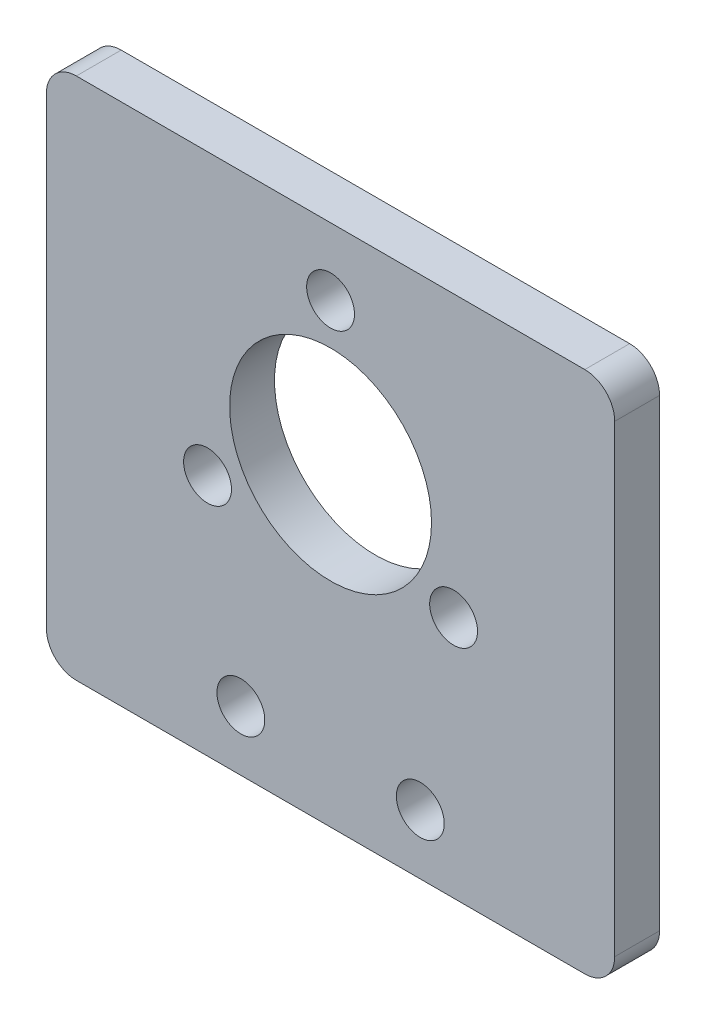
ISO-10303-21;
HEADER;
FILE_DESCRIPTION(('STEP AP214'),'2;1');
FILE_NAME('part.step','',(''),(''),'','','');
FILE_SCHEMA(('AUTOMOTIVE_DESIGN { 1 0 10303 214 1 1 1 1 }'));
ENDSEC;
DATA;
#1=APPLICATION_CONTEXT('core data for automotive mechanical design processes');
#2=APPLICATION_PROTOCOL_DEFINITION('international standard','automotive_design',2000,#1);
#3=PRODUCT_CONTEXT('',#1,'mechanical');
#4=PRODUCT('Part','Part','',(#3));
#5=PRODUCT_RELATED_PRODUCT_CATEGORY('part','',(#4));
#6=PRODUCT_DEFINITION_FORMATION('','',#4);
#7=PRODUCT_DEFINITION_CONTEXT('part definition',#1,'design');
#8=PRODUCT_DEFINITION('design','',#6,#7);
#9=PRODUCT_DEFINITION_SHAPE('','',#8);
#10=(LENGTH_UNIT() NAMED_UNIT(*) SI_UNIT(.MILLI.,.METRE.));
#11=(NAMED_UNIT(*) PLANE_ANGLE_UNIT() SI_UNIT($,.RADIAN.));
#12=(NAMED_UNIT(*) SI_UNIT($,.STERADIAN.) SOLID_ANGLE_UNIT());
#13=UNCERTAINTY_MEASURE_WITH_UNIT(LENGTH_MEASURE(1.E-05),#10,'distance_accuracy_value','');
#14=(GEOMETRIC_REPRESENTATION_CONTEXT(3) GLOBAL_UNCERTAINTY_ASSIGNED_CONTEXT((#13)) GLOBAL_UNIT_ASSIGNED_CONTEXT((#10,
#11,#12)) REPRESENTATION_CONTEXT('',''));
#15=CARTESIAN_POINT('',(0.,0.,0.));
#16=DIRECTION('',(0.,0.,1.));
#17=DIRECTION('',(1.,0.,0.));
#18=AXIS2_PLACEMENT_3D('',#15,#16,#17);
#19=CARTESIAN_POINT('',(36.,-2.,3.));
#20=DIRECTION('',(0.,0.,-1.));
#21=DIRECTION('',(-1.,0.,0.));
#22=AXIS2_PLACEMENT_3D('',#19,#20,#21);
#23=PLANE('',#22);
#24=CARTESIAN_POINT('',(25.,-38.,3.));
#25=DIRECTION('',(0.,0.,-1.));
#26=DIRECTION('',(-1.,0.,0.));
#27=AXIS2_PLACEMENT_3D('',#24,#25,#26);
#28=CIRCLE('',#27,1.6);
#29=CARTESIAN_POINT('',(23.4,-38.,3.));
#30=VERTEX_POINT('',#29);
#31=EDGE_CURVE('E177',#30,#30,#28,.T.);
#32=ORIENTED_EDGE('',*,*,#31,.T.);
#33=EDGE_LOOP('',(#32));
#34=FACE_BOUND('',#33,.T.);
#35=CARTESIAN_POINT('',(13.,-38.,3.));
#36=DIRECTION('',(0.,0.,-1.));
#37=DIRECTION('',(-1.,0.,0.));
#38=AXIS2_PLACEMENT_3D('',#35,#36,#37);
#39=CIRCLE('',#38,1.6);
#40=CARTESIAN_POINT('',(11.4,-38.,3.));
#41=VERTEX_POINT('',#40);
#42=EDGE_CURVE('E171',#41,#41,#39,.T.);
#43=ORIENTED_EDGE('',*,*,#42,.T.);
#44=EDGE_LOOP('',(#43));
#45=FACE_BOUND('',#44,.T.);
#46=DIRECTION('',(0.,1.,0.));
#47=VECTOR('',#46,1.);
#48=CARTESIAN_POINT('',(38.,-2.,3.));
#49=LINE('',#48,#47);
#50=CARTESIAN_POINT('',(38.,-40.,3.));
#51=VERTEX_POINT('',#50);
#52=CARTESIAN_POINT('',(38.,-9.00000000000001,3.));
#53=VERTEX_POINT('',#52);
#54=EDGE_CURVE('E153',#51,#53,#49,.T.);
#55=ORIENTED_EDGE('',*,*,#54,.T.);
#56=CARTESIAN_POINT('',(36.,-9.00000000000001,3.));
#57=DIRECTION('',(0.,0.,-1.));
#58=DIRECTION('',(-1.,0.,0.));
#59=AXIS2_PLACEMENT_3D('',#56,#57,#58);
#60=CIRCLE('',#59,2.);
#61=CARTESIAN_POINT('',(36.,-7.00000000000001,3.));
#62=VERTEX_POINT('',#61);
#63=EDGE_CURVE('E265',#53,#62,#60,.F.);
#64=ORIENTED_EDGE('',*,*,#63,.T.);
#65=DIRECTION('',(1.,0.,0.));
#66=VECTOR('',#65,1.);
#67=CARTESIAN_POINT('',(-8.75050010966886,-7.00000000000001,3.));
#68=LINE('',#67,#66);
#69=CARTESIAN_POINT('',(2.,-7.00000000000001,3.));
#70=VERTEX_POINT('',#69);
#71=EDGE_CURVE('E163',#70,#62,#68,.T.);
#72=ORIENTED_EDGE('',*,*,#71,.F.);
#73=CARTESIAN_POINT('',(2.,-9.00000000000001,3.));
#74=DIRECTION('',(0.,0.,-1.));
#75=DIRECTION('',(-1.,0.,0.));
#76=AXIS2_PLACEMENT_3D('',#73,#74,#75);
#77=CIRCLE('',#76,2.);
#78=CARTESIAN_POINT('',(0.,-9.00000000000001,3.));
#79=VERTEX_POINT('',#78);
#80=EDGE_CURVE('E117',#70,#79,#77,.F.);
#81=ORIENTED_EDGE('',*,*,#80,.T.);
#82=DIRECTION('',(0.,-1.,0.));
#83=VECTOR('',#82,1.);
#84=CARTESIAN_POINT('',(0.,-2.00000000000001,3.));
#85=LINE('',#84,#83);
#86=CARTESIAN_POINT('',(0.,-40.,3.));
#87=VERTEX_POINT('',#86);
#88=EDGE_CURVE('E108',#79,#87,#85,.T.);
#89=ORIENTED_EDGE('',*,*,#88,.T.);
#90=CARTESIAN_POINT('',(2.00000000000001,-40.,3.));
#91=DIRECTION('',(0.,0.,1.));
#92=DIRECTION('',(1.,0.,0.));
#93=AXIS2_PLACEMENT_3D('',#90,#91,#92);
#94=CIRCLE('',#93,2.);
#95=CARTESIAN_POINT('',(2.,-42.,3.));
#96=VERTEX_POINT('',#95);
#97=EDGE_CURVE('E113',#87,#96,#94,.T.);
#98=ORIENTED_EDGE('',*,*,#97,.T.);
#99=DIRECTION('',(1.,0.,0.));
#100=VECTOR('',#99,1.);
#101=CARTESIAN_POINT('',(2.,-42.,3.));
#102=LINE('',#101,#100);
#103=CARTESIAN_POINT('',(36.,-42.,3.));
#104=VERTEX_POINT('',#103);
#105=EDGE_CURVE('E134',#96,#104,#102,.T.);
#106=ORIENTED_EDGE('',*,*,#105,.T.);
#107=CARTESIAN_POINT('',(36.,-40.,3.));
#108=DIRECTION('',(0.,0.,1.));
#109=DIRECTION('',(1.,0.,0.));
#110=AXIS2_PLACEMENT_3D('',#107,#108,#109);
#111=CIRCLE('',#110,2.);
#112=EDGE_CURVE('E136',#104,#51,#111,.T.);
#113=ORIENTED_EDGE('',*,*,#112,.T.);
#114=EDGE_LOOP('',(#55,#64,#72,#81,#89,#98,#106,#113));
#115=FACE_BOUND('',#114,.T.);
#116=CARTESIAN_POINT('',(19.,-21.,3.));
#117=DIRECTION('',(0.,0.,1.));
#118=DIRECTION('',(1.,0.,0.));
#119=AXIS2_PLACEMENT_3D('',#116,#117,#118);
#120=CIRCLE('',#119,6.75);
#121=CARTESIAN_POINT('',(25.75,-21.,3.));
#122=VERTEX_POINT('',#121);
#123=EDGE_CURVE('E200',#122,#122,#120,.T.);
#124=ORIENTED_EDGE('',*,*,#123,.F.);
#125=EDGE_LOOP('',(#124));
#126=FACE_BOUND('',#125,.T.);
#127=CARTESIAN_POINT('',(19.,-11.5,3.));
#128=DIRECTION('',(0.,0.,1.));
#129=DIRECTION('',(1.,0.,0.));
#130=AXIS2_PLACEMENT_3D('',#127,#128,#129);
#131=CIRCLE('',#130,1.6);
#132=CARTESIAN_POINT('',(20.6,-11.5,3.));
#133=VERTEX_POINT('',#132);
#134=EDGE_CURVE('E194',#133,#133,#131,.T.);
#135=ORIENTED_EDGE('',*,*,#134,.F.);
#136=EDGE_LOOP('',(#135));
#137=FACE_BOUND('',#136,.T.);
#138=CARTESIAN_POINT('',(27.2272413359522,-25.75,3.));
#139=DIRECTION('',(0.,0.,1.));
#140=DIRECTION('',(1.,0.,0.));
#141=AXIS2_PLACEMENT_3D('',#138,#139,#140);
#142=CIRCLE('',#141,1.6);
#143=CARTESIAN_POINT('',(28.8272413359522,-25.75,3.));
#144=VERTEX_POINT('',#143);
#145=EDGE_CURVE('E188',#144,#144,#142,.T.);
#146=ORIENTED_EDGE('',*,*,#145,.F.);
#147=EDGE_LOOP('',(#146));
#148=FACE_BOUND('',#147,.T.);
#149=CARTESIAN_POINT('',(10.7727586640478,-25.75,3.));
#150=DIRECTION('',(0.,0.,1.));
#151=DIRECTION('',(1.,0.,0.));
#152=AXIS2_PLACEMENT_3D('',#149,#150,#151);
#153=CIRCLE('',#152,1.6);
#154=CARTESIAN_POINT('',(12.3727586640478,-25.75,3.));
#155=VERTEX_POINT('',#154);
#156=EDGE_CURVE('E181',#155,#155,#153,.T.);
#157=ORIENTED_EDGE('',*,*,#156,.F.);
#158=EDGE_LOOP('',(#157));
#159=FACE_BOUND('',#158,.T.);
#160=ADVANCED_FACE('F42',(#34,#45,#115,#126,#137,#148,#159),#23,.F.);
#161=CARTESIAN_POINT('',(36.,-2.,0.));
#162=DIRECTION('',(0.,0.,-1.));
#163=DIRECTION('',(-1.,0.,0.));
#164=AXIS2_PLACEMENT_3D('',#161,#162,#163);
#165=PLANE('',#164);
#166=DIRECTION('',(1.,0.,0.));
#167=VECTOR('',#166,1.);
#168=CARTESIAN_POINT('',(-8.75050010966886,-7.00000000000001,0.));
#169=LINE('',#168,#167);
#170=CARTESIAN_POINT('',(2.,-7.00000000000001,0.));
#171=VERTEX_POINT('',#170);
#172=CARTESIAN_POINT('',(36.,-7.00000000000001,0.));
#173=VERTEX_POINT('',#172);
#174=EDGE_CURVE('E167',#171,#173,#169,.T.);
#175=ORIENTED_EDGE('',*,*,#174,.T.);
#176=CARTESIAN_POINT('',(36.,-9.00000000000001,0.));
#177=DIRECTION('',(0.,0.,-1.));
#178=DIRECTION('',(-1.,0.,0.));
#179=AXIS2_PLACEMENT_3D('',#176,#177,#178);
#180=CIRCLE('',#179,2.);
#181=CARTESIAN_POINT('',(38.,-9.00000000000001,0.));
#182=VERTEX_POINT('',#181);
#183=EDGE_CURVE('E50',#173,#182,#180,.T.);
#184=ORIENTED_EDGE('',*,*,#183,.T.);
#185=DIRECTION('',(0.,1.,0.));
#186=VECTOR('',#185,1.);
#187=CARTESIAN_POINT('',(38.,-2.,0.));
#188=LINE('',#187,#186);
#189=CARTESIAN_POINT('',(38.,-40.,0.));
#190=VERTEX_POINT('',#189);
#191=EDGE_CURVE('E119',#190,#182,#188,.T.);
#192=ORIENTED_EDGE('',*,*,#191,.F.);
#193=CARTESIAN_POINT('',(36.,-40.,0.));
#194=DIRECTION('',(0.,0.,1.));
#195=DIRECTION('',(1.,0.,0.));
#196=AXIS2_PLACEMENT_3D('',#193,#194,#195);
#197=CIRCLE('',#196,2.);
#198=CARTESIAN_POINT('',(36.,-42.,0.));
#199=VERTEX_POINT('',#198);
#200=EDGE_CURVE('E276',#199,#190,#197,.T.);
#201=ORIENTED_EDGE('',*,*,#200,.F.);
#202=DIRECTION('',(1.,0.,0.));
#203=VECTOR('',#202,1.);
#204=CARTESIAN_POINT('',(2.,-42.,0.));
#205=LINE('',#204,#203);
#206=CARTESIAN_POINT('',(2.,-42.,0.));
#207=VERTEX_POINT('',#206);
#208=EDGE_CURVE('E278',#207,#199,#205,.T.);
#209=ORIENTED_EDGE('',*,*,#208,.F.);
#210=CARTESIAN_POINT('',(2.00000000000001,-40.,0.));
#211=DIRECTION('',(0.,0.,1.));
#212=DIRECTION('',(1.,0.,0.));
#213=AXIS2_PLACEMENT_3D('',#210,#211,#212);
#214=CIRCLE('',#213,2.);
#215=CARTESIAN_POINT('',(0.,-40.,0.));
#216=VERTEX_POINT('',#215);
#217=EDGE_CURVE('E279',#216,#207,#214,.T.);
#218=ORIENTED_EDGE('',*,*,#217,.F.);
#219=DIRECTION('',(0.,-1.,0.));
#220=VECTOR('',#219,1.);
#221=CARTESIAN_POINT('',(0.,-2.00000000000001,0.));
#222=LINE('',#221,#220);
#223=CARTESIAN_POINT('',(0.,-9.00000000000001,0.));
#224=VERTEX_POINT('',#223);
#225=EDGE_CURVE('E125',#224,#216,#222,.T.);
#226=ORIENTED_EDGE('',*,*,#225,.F.);
#227=CARTESIAN_POINT('',(2.,-9.00000000000001,0.));
#228=DIRECTION('',(0.,0.,-1.));
#229=DIRECTION('',(-1.,0.,0.));
#230=AXIS2_PLACEMENT_3D('',#227,#228,#229);
#231=CIRCLE('',#230,2.);
#232=EDGE_CURVE('E57',#224,#171,#231,.T.);
#233=ORIENTED_EDGE('',*,*,#232,.T.);
#234=EDGE_LOOP('',(#175,#184,#192,#201,#209,#218,#226,#233));
#235=FACE_BOUND('',#234,.T.);
#236=CARTESIAN_POINT('',(25.,-38.,0.));
#237=DIRECTION('',(0.,0.,-1.));
#238=DIRECTION('',(-1.,0.,0.));
#239=AXIS2_PLACEMENT_3D('',#236,#237,#238);
#240=CIRCLE('',#239,1.6);
#241=CARTESIAN_POINT('',(23.4,-38.,0.));
#242=VERTEX_POINT('',#241);
#243=EDGE_CURVE('E168',#242,#242,#240,.T.);
#244=ORIENTED_EDGE('',*,*,#243,.F.);
#245=EDGE_LOOP('',(#244));
#246=FACE_BOUND('',#245,.T.);
#247=CARTESIAN_POINT('',(13.,-38.,0.));
#248=DIRECTION('',(0.,0.,-1.));
#249=DIRECTION('',(1.,0.,0.));
#250=AXIS2_PLACEMENT_3D('',#247,#248,#249);
#251=CIRCLE('',#250,1.6);
#252=CARTESIAN_POINT('',(14.6,-38.,0.));
#253=VERTEX_POINT('',#252);
#254=EDGE_CURVE('E172',#253,#253,#251,.T.);
#255=ORIENTED_EDGE('',*,*,#254,.F.);
#256=EDGE_LOOP('',(#255));
#257=FACE_BOUND('',#256,.T.);
#258=CARTESIAN_POINT('',(27.2272413359522,-25.75,0.));
#259=DIRECTION('',(0.,0.,1.));
#260=DIRECTION('',(1.,0.,0.));
#261=AXIS2_PLACEMENT_3D('',#258,#259,#260);
#262=CIRCLE('',#261,1.6);
#263=CARTESIAN_POINT('',(28.8272413359522,-25.75,0.));
#264=VERTEX_POINT('',#263);
#265=EDGE_CURVE('E185',#264,#264,#262,.T.);
#266=ORIENTED_EDGE('',*,*,#265,.T.);
#267=EDGE_LOOP('',(#266));
#268=FACE_BOUND('',#267,.T.);
#269=CARTESIAN_POINT('',(19.,-21.,0.));
#270=DIRECTION('',(0.,0.,1.));
#271=DIRECTION('',(1.,0.,0.));
#272=AXIS2_PLACEMENT_3D('',#269,#270,#271);
#273=CIRCLE('',#272,6.75);
#274=CARTESIAN_POINT('',(25.75,-21.,0.));
#275=VERTEX_POINT('',#274);
#276=EDGE_CURVE('E198',#275,#275,#273,.T.);
#277=ORIENTED_EDGE('',*,*,#276,.T.);
#278=EDGE_LOOP('',(#277));
#279=FACE_BOUND('',#278,.T.);
#280=CARTESIAN_POINT('',(19.,-11.5,0.));
#281=DIRECTION('',(0.,0.,1.));
#282=DIRECTION('',(1.,0.,0.));
#283=AXIS2_PLACEMENT_3D('',#280,#281,#282);
#284=CIRCLE('',#283,1.6);
#285=CARTESIAN_POINT('',(20.6,-11.5,0.));
#286=VERTEX_POINT('',#285);
#287=EDGE_CURVE('E192',#286,#286,#284,.T.);
#288=ORIENTED_EDGE('',*,*,#287,.T.);
#289=EDGE_LOOP('',(#288));
#290=FACE_BOUND('',#289,.T.);
#291=CARTESIAN_POINT('',(10.7727586640478,-25.75,0.));
#292=DIRECTION('',(0.,0.,1.));
#293=DIRECTION('',(1.,0.,0.));
#294=AXIS2_PLACEMENT_3D('',#291,#292,#293);
#295=CIRCLE('',#294,1.6);
#296=CARTESIAN_POINT('',(12.3727586640478,-25.75,0.));
#297=VERTEX_POINT('',#296);
#298=EDGE_CURVE('E180',#297,#297,#295,.T.);
#299=ORIENTED_EDGE('',*,*,#298,.T.);
#300=EDGE_LOOP('',(#299));
#301=FACE_BOUND('',#300,.T.);
#302=ADVANCED_FACE('F206',(#235,#246,#257,#268,#279,#290,#301),#165,.T.);
#303=CARTESIAN_POINT('',(0.,-2.00000000000001,3.));
#304=DIRECTION('',(1.,0.,0.));
#305=DIRECTION('',(0.,1.,0.));
#306=AXIS2_PLACEMENT_3D('',#303,#304,#305);
#307=PLANE('',#306);
#308=ORIENTED_EDGE('',*,*,#88,.F.);
#309=DIRECTION('',(0.,0.,-1.));
#310=VECTOR('',#309,1.);
#311=CARTESIAN_POINT('',(0.,-9.00000000000001,3.));
#312=LINE('',#311,#310);
#313=EDGE_CURVE('E12',#79,#224,#312,.T.);
#314=ORIENTED_EDGE('',*,*,#313,.T.);
#315=ORIENTED_EDGE('',*,*,#225,.T.);
#316=DIRECTION('',(0.,0.,-1.));
#317=VECTOR('',#316,1.);
#318=CARTESIAN_POINT('',(0.,-40.,3.));
#319=LINE('',#318,#317);
#320=EDGE_CURVE('E122',#87,#216,#319,.T.);
#321=ORIENTED_EDGE('',*,*,#320,.F.);
#322=EDGE_LOOP('',(#308,#314,#315,#321));
#323=FACE_BOUND('',#322,.T.);
#324=ADVANCED_FACE('F123',(#323),#307,.F.);
#325=CARTESIAN_POINT('',(2.00000000000001,-40.,3.));
#326=DIRECTION('',(0.,0.,-1.));
#327=DIRECTION('',(-1.,0.,0.));
#328=AXIS2_PLACEMENT_3D('',#325,#326,#327);
#329=CYLINDRICAL_SURFACE('',#328,2.);
#330=ORIENTED_EDGE('',*,*,#217,.T.);
#331=DIRECTION('',(0.,0.,-1.));
#332=VECTOR('',#331,1.);
#333=CARTESIAN_POINT('',(2.,-42.,3.));
#334=LINE('',#333,#332);
#335=EDGE_CURVE('E129',#96,#207,#334,.T.);
#336=ORIENTED_EDGE('',*,*,#335,.F.);
#337=ORIENTED_EDGE('',*,*,#97,.F.);
#338=ORIENTED_EDGE('',*,*,#320,.T.);
#339=EDGE_LOOP('',(#330,#336,#337,#338));
#340=FACE_BOUND('',#339,.T.);
#341=ADVANCED_FACE('F131',(#340),#329,.T.);
#342=CARTESIAN_POINT('',(2.,-42.,3.));
#343=DIRECTION('',(0.,1.,0.));
#344=DIRECTION('',(0.,0.,1.));
#345=AXIS2_PLACEMENT_3D('',#342,#343,#344);
#346=PLANE('',#345);
#347=ORIENTED_EDGE('',*,*,#208,.T.);
#348=DIRECTION('',(0.,0.,-1.));
#349=VECTOR('',#348,1.);
#350=CARTESIAN_POINT('',(36.,-42.,3.));
#351=LINE('',#350,#349);
#352=EDGE_CURVE('E270',#104,#199,#351,.T.);
#353=ORIENTED_EDGE('',*,*,#352,.F.);
#354=ORIENTED_EDGE('',*,*,#105,.F.);
#355=ORIENTED_EDGE('',*,*,#335,.T.);
#356=EDGE_LOOP('',(#347,#353,#354,#355));
#357=FACE_BOUND('',#356,.T.);
#358=ADVANCED_FACE('F237',(#357),#346,.F.);
#359=CARTESIAN_POINT('',(36.,-40.,3.));
#360=DIRECTION('',(0.,0.,-1.));
#361=DIRECTION('',(-1.,0.,0.));
#362=AXIS2_PLACEMENT_3D('',#359,#360,#361);
#363=CYLINDRICAL_SURFACE('',#362,2.);
#364=ORIENTED_EDGE('',*,*,#200,.T.);
#365=DIRECTION('',(0.,0.,-1.));
#366=VECTOR('',#365,1.);
#367=CARTESIAN_POINT('',(38.,-40.,3.));
#368=LINE('',#367,#366);
#369=EDGE_CURVE('E156',#51,#190,#368,.T.);
#370=ORIENTED_EDGE('',*,*,#369,.F.);
#371=ORIENTED_EDGE('',*,*,#112,.F.);
#372=ORIENTED_EDGE('',*,*,#352,.T.);
#373=EDGE_LOOP('',(#364,#370,#371,#372));
#374=FACE_BOUND('',#373,.T.);
#375=ADVANCED_FACE('F222',(#374),#363,.T.);
#376=CARTESIAN_POINT('',(38.,-2.,3.));
#377=DIRECTION('',(-1.,0.,0.));
#378=DIRECTION('',(0.,-1.,0.));
#379=AXIS2_PLACEMENT_3D('',#376,#377,#378);
#380=PLANE('',#379);
#381=ORIENTED_EDGE('',*,*,#191,.T.);
#382=DIRECTION('',(0.,0.,1.));
#383=VECTOR('',#382,1.);
#384=CARTESIAN_POINT('',(38.,-9.00000000000001,3.));
#385=LINE('',#384,#383);
#386=EDGE_CURVE('E128',#182,#53,#385,.T.);
#387=ORIENTED_EDGE('',*,*,#386,.T.);
#388=ORIENTED_EDGE('',*,*,#54,.F.);
#389=ORIENTED_EDGE('',*,*,#369,.T.);
#390=EDGE_LOOP('',(#381,#387,#388,#389));
#391=FACE_BOUND('',#390,.T.);
#392=ADVANCED_FACE('F212',(#391),#380,.F.);
#393=CARTESIAN_POINT('',(19.,-21.,3.));
#394=DIRECTION('',(0.,0.,-1.));
#395=DIRECTION('',(-1.,0.,0.));
#396=AXIS2_PLACEMENT_3D('',#393,#394,#395);
#397=CYLINDRICAL_SURFACE('',#396,6.75);
#398=ORIENTED_EDGE('',*,*,#123,.T.);
#399=EDGE_LOOP('',(#398));
#400=FACE_BOUND('',#399,.T.);
#401=ORIENTED_EDGE('',*,*,#276,.F.);
#402=EDGE_LOOP('',(#401));
#403=FACE_BOUND('',#402,.T.);
#404=ADVANCED_FACE('F209',(#400,#403),#397,.F.);
#405=CARTESIAN_POINT('',(19.,-11.5,3.));
#406=DIRECTION('',(0.,0.,-1.));
#407=DIRECTION('',(-1.,0.,0.));
#408=AXIS2_PLACEMENT_3D('',#405,#406,#407);
#409=CYLINDRICAL_SURFACE('',#408,1.6);
#410=ORIENTED_EDGE('',*,*,#134,.T.);
#411=EDGE_LOOP('',(#410));
#412=FACE_BOUND('',#411,.T.);
#413=ORIENTED_EDGE('',*,*,#287,.F.);
#414=EDGE_LOOP('',(#413));
#415=FACE_BOUND('',#414,.T.);
#416=ADVANCED_FACE('F211',(#412,#415),#409,.F.);
#417=CARTESIAN_POINT('',(27.2272413359522,-25.75,3.));
#418=DIRECTION('',(0.,0.,-1.));
#419=DIRECTION('',(-1.,0.,0.));
#420=AXIS2_PLACEMENT_3D('',#417,#418,#419);
#421=CYLINDRICAL_SURFACE('',#420,1.6);
#422=ORIENTED_EDGE('',*,*,#145,.T.);
#423=EDGE_LOOP('',(#422));
#424=FACE_BOUND('',#423,.T.);
#425=ORIENTED_EDGE('',*,*,#265,.F.);
#426=EDGE_LOOP('',(#425));
#427=FACE_BOUND('',#426,.T.);
#428=ADVANCED_FACE('F219',(#424,#427),#421,.F.);
#429=CARTESIAN_POINT('',(10.7727586640478,-25.75,3.));
#430=DIRECTION('',(0.,0.,-1.));
#431=DIRECTION('',(-1.,0.,0.));
#432=AXIS2_PLACEMENT_3D('',#429,#430,#431);
#433=CYLINDRICAL_SURFACE('',#432,1.6);
#434=ORIENTED_EDGE('',*,*,#156,.T.);
#435=EDGE_LOOP('',(#434));
#436=FACE_BOUND('',#435,.T.);
#437=ORIENTED_EDGE('',*,*,#298,.F.);
#438=EDGE_LOOP('',(#437));
#439=FACE_BOUND('',#438,.T.);
#440=ADVANCED_FACE('F295',(#436,#439),#433,.F.);
#441=CARTESIAN_POINT('',(13.,-38.,10.));
#442=DIRECTION('',(0.,0.,-1.));
#443=DIRECTION('',(-1.,0.,0.));
#444=AXIS2_PLACEMENT_3D('',#441,#442,#443);
#445=CYLINDRICAL_SURFACE('',#444,1.6);
#446=ORIENTED_EDGE('',*,*,#254,.T.);
#447=EDGE_LOOP('',(#446));
#448=FACE_BOUND('',#447,.T.);
#449=ORIENTED_EDGE('',*,*,#42,.F.);
#450=EDGE_LOOP('',(#449));
#451=FACE_BOUND('',#450,.T.);
#452=ADVANCED_FACE('F301',(#448,#451),#445,.F.);
#453=CARTESIAN_POINT('',(25.,-38.,10.));
#454=DIRECTION('',(0.,0.,-1.));
#455=DIRECTION('',(-1.,0.,0.));
#456=AXIS2_PLACEMENT_3D('',#453,#454,#455);
#457=CYLINDRICAL_SURFACE('',#456,1.6);
#458=ORIENTED_EDGE('',*,*,#243,.T.);
#459=EDGE_LOOP('',(#458));
#460=FACE_BOUND('',#459,.T.);
#461=ORIENTED_EDGE('',*,*,#31,.F.);
#462=EDGE_LOOP('',(#461));
#463=FACE_BOUND('',#462,.T.);
#464=ADVANCED_FACE('F253',(#460,#463),#457,.F.);
#465=CARTESIAN_POINT('',(-8.75050010966886,-7.00000000000001,0.));
#466=DIRECTION('',(0.,-1.,0.));
#467=DIRECTION('',(0.,0.,-1.));
#468=AXIS2_PLACEMENT_3D('',#465,#466,#467);
#469=PLANE('',#468);
#470=ORIENTED_EDGE('',*,*,#71,.T.);
#471=DIRECTION('',(0.,0.,1.));
#472=VECTOR('',#471,1.);
#473=CARTESIAN_POINT('',(36.,-7.00000000000001,0.));
#474=LINE('',#473,#472);
#475=EDGE_CURVE('E64',#62,#173,#474,.F.);
#476=ORIENTED_EDGE('',*,*,#475,.T.);
#477=ORIENTED_EDGE('',*,*,#174,.F.);
#478=DIRECTION('',(0.,0.,-1.));
#479=VECTOR('',#478,1.);
#480=CARTESIAN_POINT('',(2.,-7.00000000000001,0.));
#481=LINE('',#480,#479);
#482=EDGE_CURVE('E263',#171,#70,#481,.F.);
#483=ORIENTED_EDGE('',*,*,#482,.T.);
#484=EDGE_LOOP('',(#470,#476,#477,#483));
#485=FACE_BOUND('',#484,.T.);
#486=ADVANCED_FACE('F247',(#485),#469,.F.);
#487=CARTESIAN_POINT('',(36.,-9.00000000000001,3.));
#488=DIRECTION('',(0.,0.,1.));
#489=DIRECTION('',(1.,0.,0.));
#490=AXIS2_PLACEMENT_3D('',#487,#488,#489);
#491=CYLINDRICAL_SURFACE('',#490,2.);
#492=ORIENTED_EDGE('',*,*,#183,.F.);
#493=ORIENTED_EDGE('',*,*,#475,.F.);
#494=ORIENTED_EDGE('',*,*,#63,.F.);
#495=ORIENTED_EDGE('',*,*,#386,.F.);
#496=EDGE_LOOP('',(#492,#493,#494,#495));
#497=FACE_BOUND('',#496,.T.);
#498=ADVANCED_FACE('F245',(#497),#491,.T.);
#499=CARTESIAN_POINT('',(2.,-9.00000000000001,3.));
#500=DIRECTION('',(0.,0.,-1.));
#501=DIRECTION('',(-1.,0.,0.));
#502=AXIS2_PLACEMENT_3D('',#499,#500,#501);
#503=CYLINDRICAL_SURFACE('',#502,2.);
#504=ORIENTED_EDGE('',*,*,#80,.F.);
#505=ORIENTED_EDGE('',*,*,#482,.F.);
#506=ORIENTED_EDGE('',*,*,#232,.F.);
#507=ORIENTED_EDGE('',*,*,#313,.F.);
#508=EDGE_LOOP('',(#504,#505,#506,#507));
#509=FACE_BOUND('',#508,.T.);
#510=ADVANCED_FACE('F44',(#509),#503,.T.);
#511=CLOSED_SHELL('',(#160,#302,#324,#341,#358,#375,#392,#404,#416,#428,#440,#452,#464,#486,
#498,#510));
#512=MANIFOLD_SOLID_BREP('B2',#511);
#513=ADVANCED_BREP_SHAPE_REPRESENTATION('',(#18,#512),#14);
#514=SHAPE_DEFINITION_REPRESENTATION(#9,#513);
ENDSEC;
END-ISO-10303-21;
